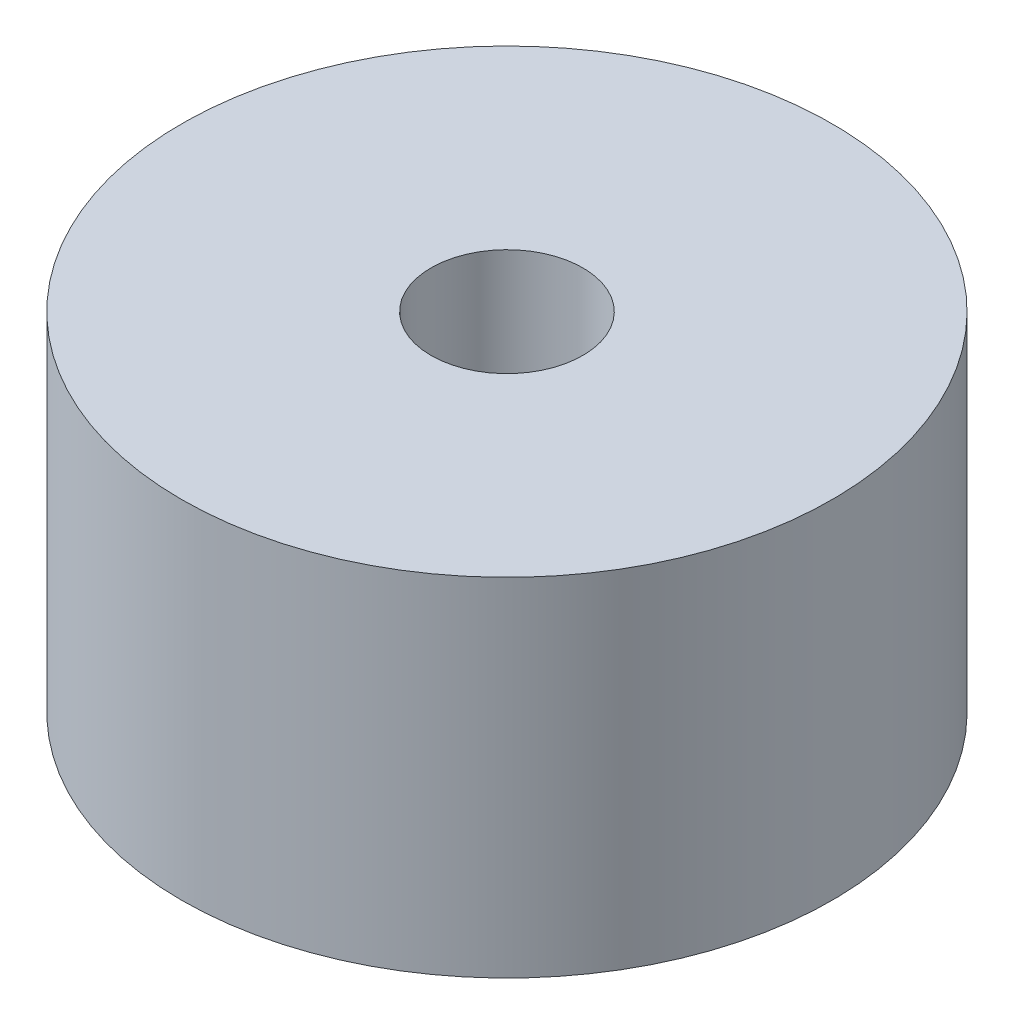
ISO-10303-21;
HEADER;
FILE_DESCRIPTION(('STEP AP214'),'2;1');
FILE_NAME('part.step','',(''),(''),'','','');
FILE_SCHEMA(('AUTOMOTIVE_DESIGN { 1 0 10303 214 1 1 1 1 }'));
ENDSEC;
DATA;
#1=APPLICATION_CONTEXT('core data for automotive mechanical design processes');
#2=APPLICATION_PROTOCOL_DEFINITION('international standard','automotive_design',2000,#1);
#3=PRODUCT_CONTEXT('',#1,'mechanical');
#4=PRODUCT('Part','Part','',(#3));
#5=PRODUCT_RELATED_PRODUCT_CATEGORY('part','',(#4));
#6=PRODUCT_DEFINITION_FORMATION('','',#4);
#7=PRODUCT_DEFINITION_CONTEXT('part definition',#1,'design');
#8=PRODUCT_DEFINITION('design','',#6,#7);
#9=PRODUCT_DEFINITION_SHAPE('','',#8);
#10=(LENGTH_UNIT() NAMED_UNIT(*) SI_UNIT(.MILLI.,.METRE.));
#11=(NAMED_UNIT(*) PLANE_ANGLE_UNIT() SI_UNIT($,.RADIAN.));
#12=(NAMED_UNIT(*) SI_UNIT($,.STERADIAN.) SOLID_ANGLE_UNIT());
#13=UNCERTAINTY_MEASURE_WITH_UNIT(LENGTH_MEASURE(1.E-05),#10,'distance_accuracy_value','');
#14=(GEOMETRIC_REPRESENTATION_CONTEXT(3) GLOBAL_UNCERTAINTY_ASSIGNED_CONTEXT((#13)) GLOBAL_UNIT_ASSIGNED_CONTEXT((#10,
#11,#12)) REPRESENTATION_CONTEXT('',''));
#15=CARTESIAN_POINT('',(0.,0.,0.));
#16=DIRECTION('',(0.,0.,1.));
#17=DIRECTION('',(1.,0.,0.));
#18=AXIS2_PLACEMENT_3D('',#15,#16,#17);
#19=CARTESIAN_POINT('',(0.,8.,0.));
#20=DIRECTION('',(0.,1.,0.));
#21=DIRECTION('',(0.,0.,1.));
#22=AXIS2_PLACEMENT_3D('',#19,#20,#21);
#23=PLANE('',#22);
#24=CARTESIAN_POINT('',(0.,8.,0.));
#25=DIRECTION('',(0.,1.,0.));
#26=DIRECTION('',(0.,0.,1.));
#27=AXIS2_PLACEMENT_3D('',#24,#25,#26);
#28=CIRCLE('',#27,7.5);
#29=CARTESIAN_POINT('',(0.,8.,7.5));
#30=VERTEX_POINT('',#29);
#31=EDGE_CURVE('E10',#30,#30,#28,.T.);
#32=ORIENTED_EDGE('',*,*,#31,.T.);
#33=EDGE_LOOP('',(#32));
#34=FACE_BOUND('',#33,.T.);
#35=CARTESIAN_POINT('',(0.,8.,0.));
#36=DIRECTION('',(0.,1.,0.));
#37=DIRECTION('',(0.,0.,1.));
#38=AXIS2_PLACEMENT_3D('',#35,#36,#37);
#39=CIRCLE('',#38,1.75);
#40=CARTESIAN_POINT('',(0.,8.,1.75));
#41=VERTEX_POINT('',#40);
#42=EDGE_CURVE('E54',#41,#41,#39,.T.);
#43=ORIENTED_EDGE('',*,*,#42,.F.);
#44=EDGE_LOOP('',(#43));
#45=FACE_BOUND('',#44,.T.);
#46=ADVANCED_FACE('F41',(#34,#45),#23,.T.);
#47=CARTESIAN_POINT('',(0.,0.,0.));
#48=DIRECTION('',(0.,1.,0.));
#49=DIRECTION('',(0.,0.,1.));
#50=AXIS2_PLACEMENT_3D('',#47,#48,#49);
#51=PLANE('',#50);
#52=CARTESIAN_POINT('',(0.,0.,0.));
#53=DIRECTION('',(0.,1.,0.));
#54=DIRECTION('',(0.,0.,1.));
#55=AXIS2_PLACEMENT_3D('',#52,#53,#54);
#56=CIRCLE('',#55,7.5);
#57=CARTESIAN_POINT('',(0.,0.,7.5));
#58=VERTEX_POINT('',#57);
#59=EDGE_CURVE('E45',#58,#58,#56,.T.);
#60=ORIENTED_EDGE('',*,*,#59,.F.);
#61=EDGE_LOOP('',(#60));
#62=FACE_BOUND('',#61,.T.);
#63=CARTESIAN_POINT('',(0.,0.,0.));
#64=DIRECTION('',(0.,1.,0.));
#65=DIRECTION('',(0.,0.,1.));
#66=AXIS2_PLACEMENT_3D('',#63,#64,#65);
#67=CIRCLE('',#66,1.75);
#68=CARTESIAN_POINT('',(0.,0.,1.75));
#69=VERTEX_POINT('',#68);
#70=EDGE_CURVE('E56',#69,#69,#67,.T.);
#71=ORIENTED_EDGE('',*,*,#70,.T.);
#72=EDGE_LOOP('',(#71));
#73=FACE_BOUND('',#72,.T.);
#74=ADVANCED_FACE('F68',(#62,#73),#51,.F.);
#75=CARTESIAN_POINT('',(0.,8.,0.));
#76=DIRECTION('',(0.,-1.,0.));
#77=DIRECTION('',(0.,0.,-1.));
#78=AXIS2_PLACEMENT_3D('',#75,#76,#77);
#79=CYLINDRICAL_SURFACE('',#78,7.5);
#80=ORIENTED_EDGE('',*,*,#31,.F.);
#81=EDGE_LOOP('',(#80));
#82=FACE_BOUND('',#81,.T.);
#83=ORIENTED_EDGE('',*,*,#59,.T.);
#84=EDGE_LOOP('',(#83));
#85=FACE_BOUND('',#84,.T.);
#86=ADVANCED_FACE('F43',(#82,#85),#79,.T.);
#87=CARTESIAN_POINT('',(0.,8.,0.));
#88=DIRECTION('',(0.,-1.,0.));
#89=DIRECTION('',(0.,0.,-1.));
#90=AXIS2_PLACEMENT_3D('',#87,#88,#89);
#91=CYLINDRICAL_SURFACE('',#90,1.75);
#92=ORIENTED_EDGE('',*,*,#42,.T.);
#93=EDGE_LOOP('',(#92));
#94=FACE_BOUND('',#93,.T.);
#95=ORIENTED_EDGE('',*,*,#70,.F.);
#96=EDGE_LOOP('',(#95));
#97=FACE_BOUND('',#96,.T.);
#98=ADVANCED_FACE('F64',(#94,#97),#91,.F.);
#99=CLOSED_SHELL('',(#46,#74,#86,#98));
#100=MANIFOLD_SOLID_BREP('B2',#99);
#101=ADVANCED_BREP_SHAPE_REPRESENTATION('',(#18,#100),#14);
#102=SHAPE_DEFINITION_REPRESENTATION(#9,#101);
ENDSEC;
END-ISO-10303-21;
